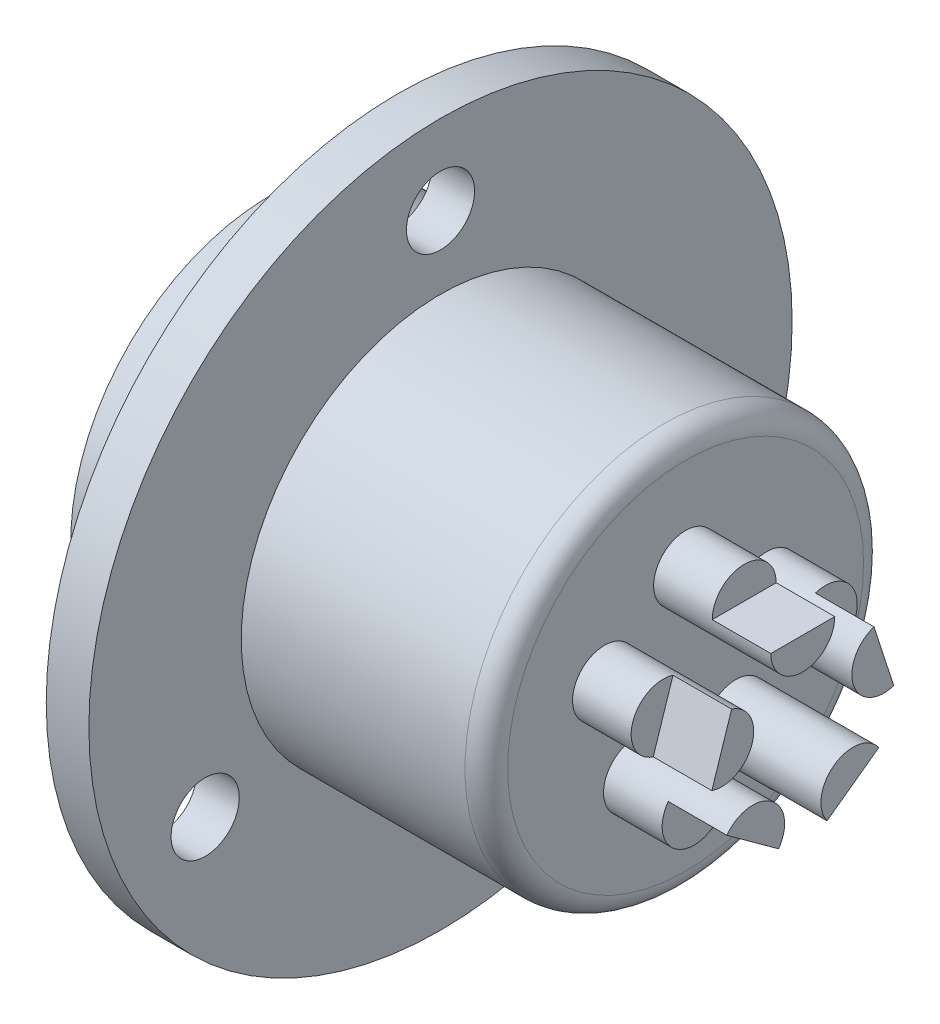
ISO-10303-21;
HEADER;
FILE_DESCRIPTION(('STEP AP214'),'2;1');
FILE_NAME('part.step','',(''),(''),'','','');
FILE_SCHEMA(('AUTOMOTIVE_DESIGN { 1 0 10303 214 1 1 1 1 }'));
ENDSEC;
DATA;
#1=APPLICATION_CONTEXT('core data for automotive mechanical design processes');
#2=APPLICATION_PROTOCOL_DEFINITION('international standard','automotive_design',2000,#1);
#3=PRODUCT_CONTEXT('',#1,'mechanical');
#4=PRODUCT('Part','Part','',(#3));
#5=PRODUCT_RELATED_PRODUCT_CATEGORY('part','',(#4));
#6=PRODUCT_DEFINITION_FORMATION('','',#4);
#7=PRODUCT_DEFINITION_CONTEXT('part definition',#1,'design');
#8=PRODUCT_DEFINITION('design','',#6,#7);
#9=PRODUCT_DEFINITION_SHAPE('','',#8);
#10=(LENGTH_UNIT() NAMED_UNIT(*) SI_UNIT(.MILLI.,.METRE.));
#11=(NAMED_UNIT(*) PLANE_ANGLE_UNIT() SI_UNIT($,.RADIAN.));
#12=(NAMED_UNIT(*) SI_UNIT($,.STERADIAN.) SOLID_ANGLE_UNIT());
#13=UNCERTAINTY_MEASURE_WITH_UNIT(LENGTH_MEASURE(1.E-05),#10,'distance_accuracy_value','');
#14=(GEOMETRIC_REPRESENTATION_CONTEXT(3) GLOBAL_UNCERTAINTY_ASSIGNED_CONTEXT((#13)) GLOBAL_UNIT_ASSIGNED_CONTEXT((#10,
#11,#12)) REPRESENTATION_CONTEXT('',''));
#15=CARTESIAN_POINT('',(0.,0.,0.));
#16=DIRECTION('',(0.,0.,1.));
#17=DIRECTION('',(1.,0.,0.));
#18=AXIS2_PLACEMENT_3D('',#15,#16,#17);
#19=CARTESIAN_POINT('',(25.,-8.11393202250022,3.80422606518062));
#20=DIRECTION('',(-1.,0.,0.));
#21=DIRECTION('',(0.,-0.951056516295155,0.309016994374945));
#22=AXIS2_PLACEMENT_3D('',#19,#20,#21);
#23=PLANE('',#22);
#24=DIRECTION('',(0.,0.951056516295155,-0.309016994374945));
#25=VECTOR('',#24,1.);
#26=CARTESIAN_POINT('',(25.,-9.54051679694295,4.26775155674304));
#27=LINE('',#26,#25);
#28=CARTESIAN_POINT('',(25.,-9.54051679694295,4.26775155674304));
#29=VERTEX_POINT('',#28);
#30=CARTESIAN_POINT('',(25.,-6.68734724805749,3.3407005736182));
#31=VERTEX_POINT('',#30);
#32=EDGE_CURVE('E306',#29,#31,#27,.T.);
#33=ORIENTED_EDGE('',*,*,#32,.F.);
#34=CARTESIAN_POINT('',(25.,-8.11393202250022,3.80422606518062));
#35=DIRECTION('',(-1.,0.,0.));
#36=DIRECTION('',(0.,-0.951056516295155,0.309016994374945));
#37=AXIS2_PLACEMENT_3D('',#34,#35,#36);
#38=CIRCLE('',#37,1.5);
#39=EDGE_CURVE('E129',#31,#29,#38,.T.);
#40=ORIENTED_EDGE('',*,*,#39,.F.);
#41=EDGE_LOOP('',(#33,#40));
#42=FACE_BOUND('',#41,.T.);
#43=ADVANCED_FACE('F34',(#42),#23,.F.);
#44=CARTESIAN_POINT('',(25.,-12.5860679774998,2.35114100916987));
#45=DIRECTION('',(-1.,0.,0.));
#46=DIRECTION('',(0.,0.,1.));
#47=AXIS2_PLACEMENT_3D('',#44,#45,#46);
#48=CYLINDRICAL_SURFACE('',#47,1.5);
#49=DIRECTION('',(1.,0.,0.));
#50=VECTOR('',#49,1.);
#51=CARTESIAN_POINT('',(25.,-13.4677458559385,1.13761551760745));
#52=LINE('',#51,#50);
#53=CARTESIAN_POINT('',(22.25,-13.4677458559385,1.13761551760745));
#54=VERTEX_POINT('',#53);
#55=CARTESIAN_POINT('',(25.,-13.4677458559385,1.13761551760745));
#56=VERTEX_POINT('',#55);
#57=EDGE_CURVE('E57',#54,#56,#52,.T.);
#58=ORIENTED_EDGE('',*,*,#57,.F.);
#59=CARTESIAN_POINT('',(22.25,-12.5860679774998,2.35114100916987));
#60=DIRECTION('',(-1.,0.,0.));
#61=DIRECTION('',(0.,0.,1.));
#62=AXIS2_PLACEMENT_3D('',#59,#60,#61);
#63=CIRCLE('',#62,1.5);
#64=CARTESIAN_POINT('',(22.25,-11.7043900990611,3.5646665007323));
#65=VERTEX_POINT('',#64);
#66=EDGE_CURVE('E125',#65,#54,#63,.F.);
#67=ORIENTED_EDGE('',*,*,#66,.F.);
#68=DIRECTION('',(-1.,0.,0.));
#69=VECTOR('',#68,1.);
#70=CARTESIAN_POINT('',(25.,-11.7043900990611,3.5646665007323));
#71=LINE('',#70,#69);
#72=CARTESIAN_POINT('',(25.,-11.7043900990611,3.5646665007323));
#73=VERTEX_POINT('',#72);
#74=EDGE_CURVE('E114',#73,#65,#71,.T.);
#75=ORIENTED_EDGE('',*,*,#74,.F.);
#76=CARTESIAN_POINT('',(25.,-12.5860679774998,2.35114100916987));
#77=DIRECTION('',(-1.,0.,0.));
#78=DIRECTION('',(0.,-0.587785252292469,-0.809016994374951));
#79=AXIS2_PLACEMENT_3D('',#76,#77,#78);
#80=CIRCLE('',#79,1.5);
#81=EDGE_CURVE('E124',#73,#56,#80,.T.);
#82=ORIENTED_EDGE('',*,*,#81,.T.);
#83=EDGE_LOOP('',(#58,#67,#75,#82));
#84=FACE_BOUND('',#83,.T.);
#85=CARTESIAN_POINT('',(19.5,-12.5860679774998,2.35114100916987));
#86=DIRECTION('',(1.,0.,0.));
#87=DIRECTION('',(0.,0.,-1.));
#88=AXIS2_PLACEMENT_3D('',#85,#86,#87);
#89=CIRCLE('',#88,1.5);
#90=CARTESIAN_POINT('',(19.5,-12.5860679774998,0.851141009169874));
#91=VERTEX_POINT('',#90);
#92=EDGE_CURVE('E175',#91,#91,#89,.T.);
#93=ORIENTED_EDGE('',*,*,#92,.T.);
#94=EDGE_LOOP('',(#93));
#95=FACE_BOUND('',#94,.T.);
#96=ADVANCED_FACE('F122',(#84,#95),#48,.T.);
#97=CARTESIAN_POINT('',(25.,-12.5860679774998,2.35114100916987));
#98=DIRECTION('',(-1.,0.,0.));
#99=DIRECTION('',(0.,-0.587785252292469,-0.809016994374951));
#100=AXIS2_PLACEMENT_3D('',#97,#98,#99);
#101=PLANE('',#100);
#102=DIRECTION('',(0.,0.587785252292468,0.809016994374951));
#103=VECTOR('',#102,1.);
#104=CARTESIAN_POINT('',(25.,-13.4677458559385,1.13761551760745));
#105=LINE('',#104,#103);
#106=EDGE_CURVE('E111',#56,#73,#105,.T.);
#107=ORIENTED_EDGE('',*,*,#106,.F.);
#108=ORIENTED_EDGE('',*,*,#81,.F.);
#109=EDGE_LOOP('',(#107,#108));
#110=FACE_BOUND('',#109,.T.);
#111=ADVANCED_FACE('F128',(#110),#101,.F.);
#112=CARTESIAN_POINT('',(25.,-12.5860679774998,-2.35114100916992));
#113=DIRECTION('',(-1.,0.,0.));
#114=DIRECTION('',(0.,0.58778525229248,-0.809016994374942));
#115=AXIS2_PLACEMENT_3D('',#112,#113,#114);
#116=PLANE('',#115);
#117=DIRECTION('',(0.,-0.58778525229248,0.809016994374942));
#118=VECTOR('',#117,1.);
#119=CARTESIAN_POINT('',(25.,-11.704390099061,-3.56466650073234));
#120=LINE('',#119,#118);
#121=CARTESIAN_POINT('',(25.,-11.704390099061,-3.56466650073233));
#122=VERTEX_POINT('',#121);
#123=CARTESIAN_POINT('',(25.,-13.4677458559385,-1.13761551760751));
#124=VERTEX_POINT('',#123);
#125=EDGE_CURVE('E307',#122,#124,#120,.T.);
#126=ORIENTED_EDGE('',*,*,#125,.F.);
#127=CARTESIAN_POINT('',(25.,-12.5860679774998,-2.35114100916992));
#128=DIRECTION('',(-1.,0.,0.));
#129=DIRECTION('',(0.,0.58778525229248,-0.809016994374942));
#130=AXIS2_PLACEMENT_3D('',#127,#128,#129);
#131=CIRCLE('',#130,1.5);
#132=EDGE_CURVE('E130',#124,#122,#131,.T.);
#133=ORIENTED_EDGE('',*,*,#132,.F.);
#134=EDGE_LOOP('',(#126,#133));
#135=FACE_BOUND('',#134,.T.);
#136=ADVANCED_FACE('F365',(#135),#116,.F.);
#137=CARTESIAN_POINT('',(25.,-8.11393202250017,-3.8042260651806));
#138=DIRECTION('',(-1.,0.,0.));
#139=DIRECTION('',(0.,0.95105651629515,0.309016994374958));
#140=AXIS2_PLACEMENT_3D('',#137,#138,#139);
#141=PLANE('',#140);
#142=DIRECTION('',(0.,-0.95105651629515,-0.309016994374958));
#143=VECTOR('',#142,1.);
#144=CARTESIAN_POINT('',(25.,-6.68734724805744,-3.34070057361816));
#145=LINE('',#144,#143);
#146=CARTESIAN_POINT('',(25.,-6.68734724805744,-3.34070057361816));
#147=VERTEX_POINT('',#146);
#148=CARTESIAN_POINT('',(25.,-9.54051679694289,-4.26775155674304));
#149=VERTEX_POINT('',#148);
#150=EDGE_CURVE('E200',#147,#149,#145,.T.);
#151=ORIENTED_EDGE('',*,*,#150,.F.);
#152=CARTESIAN_POINT('',(25.,-8.11393202250017,-3.8042260651806));
#153=DIRECTION('',(-1.,0.,0.));
#154=DIRECTION('',(0.,0.95105651629515,0.309016994374958));
#155=AXIS2_PLACEMENT_3D('',#152,#153,#154);
#156=CIRCLE('',#155,1.5);
#157=EDGE_CURVE('E136',#149,#147,#156,.T.);
#158=ORIENTED_EDGE('',*,*,#157,.F.);
#159=EDGE_LOOP('',(#151,#158));
#160=FACE_BOUND('',#159,.T.);
#161=ADVANCED_FACE('F244',(#160),#141,.F.);
#162=CARTESIAN_POINT('',(25.,-5.35,0.));
#163=DIRECTION('',(-1.,0.,0.));
#164=DIRECTION('',(0.,0.,1.));
#165=AXIS2_PLACEMENT_3D('',#162,#163,#164);
#166=PLANE('',#165);
#167=DIRECTION('',(0.,0.,-1.));
#168=VECTOR('',#167,1.);
#169=CARTESIAN_POINT('',(25.,-5.35,1.5));
#170=LINE('',#169,#168);
#171=CARTESIAN_POINT('',(25.,-5.35,1.5));
#172=VERTEX_POINT('',#171);
#173=CARTESIAN_POINT('',(25.,-5.35,-1.5));
#174=VERTEX_POINT('',#173);
#175=EDGE_CURVE('E133',#172,#174,#170,.T.);
#176=ORIENTED_EDGE('',*,*,#175,.F.);
#177=CARTESIAN_POINT('',(25.,-5.35,0.));
#178=DIRECTION('',(-1.,0.,0.));
#179=DIRECTION('',(0.,0.,1.));
#180=AXIS2_PLACEMENT_3D('',#177,#178,#179);
#181=CIRCLE('',#180,1.5);
#182=EDGE_CURVE('E149',#174,#172,#181,.T.);
#183=ORIENTED_EDGE('',*,*,#182,.F.);
#184=EDGE_LOOP('',(#176,#183));
#185=FACE_BOUND('',#184,.T.);
#186=ADVANCED_FACE('F240',(#185),#166,.F.);
#187=CARTESIAN_POINT('',(0.,-9.35,0.));
#188=DIRECTION('',(-1.,0.,0.));
#189=DIRECTION('',(0.,0.,1.));
#190=AXIS2_PLACEMENT_3D('',#187,#188,#189);
#191=PLANE('',#190);
#192=CARTESIAN_POINT('',(0.,-9.35,0.));
#193=DIRECTION('',(-1.,0.,0.));
#194=DIRECTION('',(0.,0.,1.));
#195=AXIS2_PLACEMENT_3D('',#192,#193,#194);
#196=CIRCLE('',#195,8.);
#197=CARTESIAN_POINT('',(0.,-9.35,8.));
#198=VERTEX_POINT('',#197);
#199=EDGE_CURVE('E277',#198,#198,#196,.T.);
#200=ORIENTED_EDGE('',*,*,#199,.F.);
#201=EDGE_LOOP('',(#200));
#202=FACE_BOUND('',#201,.T.);
#203=CARTESIAN_POINT('',(0.,-9.35,0.));
#204=DIRECTION('',(1.,0.,0.));
#205=DIRECTION('',(0.,0.,-1.));
#206=AXIS2_PLACEMENT_3D('',#203,#204,#205);
#207=CIRCLE('',#206,9.35);
#208=CARTESIAN_POINT('',(0.,-9.35,-9.35));
#209=VERTEX_POINT('',#208);
#210=EDGE_CURVE('E164',#209,#209,#207,.T.);
#211=ORIENTED_EDGE('',*,*,#210,.F.);
#212=EDGE_LOOP('',(#211));
#213=FACE_BOUND('',#212,.T.);
#214=ADVANCED_FACE('F243',(#202,#213),#191,.T.);
#215=CARTESIAN_POINT('',(19.5,-9.35,0.));
#216=DIRECTION('',(1.,0.,0.));
#217=DIRECTION('',(0.,0.,-1.));
#218=AXIS2_PLACEMENT_3D('',#215,#216,#217);
#219=CYLINDRICAL_SURFACE('',#218,9.35);
#220=ORIENTED_EDGE('',*,*,#210,.T.);
#221=EDGE_LOOP('',(#220));
#222=FACE_BOUND('',#221,.T.);
#223=CARTESIAN_POINT('',(6.,-9.35,0.));
#224=DIRECTION('',(1.,0.,0.));
#225=DIRECTION('',(0.,0.,-1.));
#226=AXIS2_PLACEMENT_3D('',#223,#224,#225);
#227=CIRCLE('',#226,9.35);
#228=CARTESIAN_POINT('',(6.,-9.35,-9.35));
#229=VERTEX_POINT('',#228);
#230=EDGE_CURVE('E161',#229,#229,#227,.T.);
#231=ORIENTED_EDGE('',*,*,#230,.F.);
#232=EDGE_LOOP('',(#231));
#233=FACE_BOUND('',#232,.T.);
#234=ADVANCED_FACE('F266',(#222,#233),#219,.T.);
#235=CARTESIAN_POINT('',(6.,0.,0.));
#236=DIRECTION('',(-1.,0.,0.));
#237=DIRECTION('',(0.,0.,1.));
#238=AXIS2_PLACEMENT_3D('',#235,#236,#237);
#239=PLANE('',#238);
#240=CARTESIAN_POINT('',(6.,3.4,0.));
#241=DIRECTION('',(1.,0.,0.));
#242=DIRECTION('',(0.,0.,-1.));
#243=AXIS2_PLACEMENT_3D('',#240,#241,#242);
#244=CIRCLE('',#243,1.6);
#245=CARTESIAN_POINT('',(6.,3.4,-1.60000000000002));
#246=VERTEX_POINT('',#245);
#247=EDGE_CURVE('E195',#246,#246,#244,.T.);
#248=ORIENTED_EDGE('',*,*,#247,.T.);
#249=EDGE_LOOP('',(#248));
#250=FACE_BOUND('',#249,.T.);
#251=CARTESIAN_POINT('',(6.,-15.725,-11.0418238982516));
#252=DIRECTION('',(1.,0.,0.));
#253=DIRECTION('',(0.,0.,-1.));
#254=AXIS2_PLACEMENT_3D('',#251,#252,#253);
#255=CIRCLE('',#254,1.59999999999999);
#256=CARTESIAN_POINT('',(6.,-15.725,-12.6418238982516));
#257=VERTEX_POINT('',#256);
#258=EDGE_CURVE('E299',#257,#257,#255,.T.);
#259=ORIENTED_EDGE('',*,*,#258,.T.);
#260=EDGE_LOOP('',(#259));
#261=FACE_BOUND('',#260,.T.);
#262=CARTESIAN_POINT('',(6.,-15.725,11.0418238982516));
#263=DIRECTION('',(1.,0.,0.));
#264=DIRECTION('',(0.,0.,-1.));
#265=AXIS2_PLACEMENT_3D('',#262,#263,#264);
#266=CIRCLE('',#265,1.60000000000001);
#267=CARTESIAN_POINT('',(6.,-15.725,9.4418238982516));
#268=VERTEX_POINT('',#267);
#269=EDGE_CURVE('E294',#268,#268,#266,.T.);
#270=ORIENTED_EDGE('',*,*,#269,.T.);
#271=EDGE_LOOP('',(#270));
#272=FACE_BOUND('',#271,.T.);
#273=ORIENTED_EDGE('',*,*,#230,.T.);
#274=EDGE_LOOP('',(#273));
#275=FACE_BOUND('',#274,.T.);
#276=CARTESIAN_POINT('',(6.,-9.35,0.));
#277=DIRECTION('',(1.,0.,0.));
#278=DIRECTION('',(0.,0.,-1.));
#279=AXIS2_PLACEMENT_3D('',#276,#277,#278);
#280=CIRCLE('',#279,16.5);
#281=CARTESIAN_POINT('',(6.,-9.35,-16.5));
#282=VERTEX_POINT('',#281);
#283=EDGE_CURVE('E158',#282,#282,#280,.T.);
#284=ORIENTED_EDGE('',*,*,#283,.F.);
#285=EDGE_LOOP('',(#284));
#286=FACE_BOUND('',#285,.T.);
#287=ADVANCED_FACE('F262',(#250,#261,#272,#275,#286),#239,.T.);
#288=CARTESIAN_POINT('',(19.5,-9.35,0.));
#289=DIRECTION('',(1.,0.,0.));
#290=DIRECTION('',(0.,0.,-1.));
#291=AXIS2_PLACEMENT_3D('',#288,#289,#290);
#292=CYLINDRICAL_SURFACE('',#291,16.5);
#293=ORIENTED_EDGE('',*,*,#283,.T.);
#294=EDGE_LOOP('',(#293));
#295=FACE_BOUND('',#294,.T.);
#296=CARTESIAN_POINT('',(8.,-9.35,0.));
#297=DIRECTION('',(1.,0.,0.));
#298=DIRECTION('',(0.,0.,-1.));
#299=AXIS2_PLACEMENT_3D('',#296,#297,#298);
#300=CIRCLE('',#299,16.5);
#301=CARTESIAN_POINT('',(8.,-9.35,-16.5));
#302=VERTEX_POINT('',#301);
#303=EDGE_CURVE('E155',#302,#302,#300,.T.);
#304=ORIENTED_EDGE('',*,*,#303,.F.);
#305=EDGE_LOOP('',(#304));
#306=FACE_BOUND('',#305,.T.);
#307=ADVANCED_FACE('F258',(#295,#306),#292,.T.);
#308=CARTESIAN_POINT('',(8.,7.15,0.));
#309=DIRECTION('',(1.,0.,0.));
#310=DIRECTION('',(0.,0.,-1.));
#311=AXIS2_PLACEMENT_3D('',#308,#309,#310);
#312=PLANE('',#311);
#313=CARTESIAN_POINT('',(8.,3.4,0.));
#314=DIRECTION('',(1.,0.,0.));
#315=DIRECTION('',(0.,0.,-1.));
#316=AXIS2_PLACEMENT_3D('',#313,#314,#315);
#317=CIRCLE('',#316,1.6);
#318=CARTESIAN_POINT('',(8.,3.4,-1.60000000000002));
#319=VERTEX_POINT('',#318);
#320=EDGE_CURVE('E198',#319,#319,#317,.F.);
#321=ORIENTED_EDGE('',*,*,#320,.T.);
#322=EDGE_LOOP('',(#321));
#323=FACE_BOUND('',#322,.T.);
#324=CARTESIAN_POINT('',(8.,-15.725,-11.0418238982516));
#325=DIRECTION('',(1.,0.,0.));
#326=DIRECTION('',(0.,0.,-1.));
#327=AXIS2_PLACEMENT_3D('',#324,#325,#326);
#328=CIRCLE('',#327,1.59999999999999);
#329=CARTESIAN_POINT('',(8.,-15.725,-12.6418238982516));
#330=VERTEX_POINT('',#329);
#331=EDGE_CURVE('E194',#330,#330,#328,.F.);
#332=ORIENTED_EDGE('',*,*,#331,.T.);
#333=EDGE_LOOP('',(#332));
#334=FACE_BOUND('',#333,.T.);
#335=CARTESIAN_POINT('',(8.,-15.725,11.0418238982516));
#336=DIRECTION('',(1.,0.,0.));
#337=DIRECTION('',(0.,0.,-1.));
#338=AXIS2_PLACEMENT_3D('',#335,#336,#337);
#339=CIRCLE('',#338,1.60000000000001);
#340=CARTESIAN_POINT('',(8.,-15.725,9.4418238982516));
#341=VERTEX_POINT('',#340);
#342=EDGE_CURVE('E191',#341,#341,#339,.F.);
#343=ORIENTED_EDGE('',*,*,#342,.T.);
#344=EDGE_LOOP('',(#343));
#345=FACE_BOUND('',#344,.T.);
#346=ORIENTED_EDGE('',*,*,#303,.T.);
#347=EDGE_LOOP('',(#346));
#348=FACE_BOUND('',#347,.T.);
#349=CARTESIAN_POINT('',(8.,-9.35,0.));
#350=DIRECTION('',(1.,0.,0.));
#351=DIRECTION('',(0.,0.,-1.));
#352=AXIS2_PLACEMENT_3D('',#349,#350,#351);
#353=CIRCLE('',#352,9.35);
#354=CARTESIAN_POINT('',(8.,-9.35,-9.35));
#355=VERTEX_POINT('',#354);
#356=EDGE_CURVE('E152',#355,#355,#353,.T.);
#357=ORIENTED_EDGE('',*,*,#356,.F.);
#358=EDGE_LOOP('',(#357));
#359=FACE_BOUND('',#358,.T.);
#360=ADVANCED_FACE('F254',(#323,#334,#345,#348,#359),#312,.T.);
#361=CARTESIAN_POINT('',(19.5,-9.35,0.));
#362=DIRECTION('',(1.,0.,0.));
#363=DIRECTION('',(0.,0.,-1.));
#364=AXIS2_PLACEMENT_3D('',#361,#362,#363);
#365=CYLINDRICAL_SURFACE('',#364,9.35);
#366=CARTESIAN_POINT('',(18.5,-9.35,0.));
#367=DIRECTION('',(1.,0.,0.));
#368=DIRECTION('',(0.,0.,-1.));
#369=AXIS2_PLACEMENT_3D('',#366,#367,#368);
#370=CIRCLE('',#369,9.35);
#371=CARTESIAN_POINT('',(18.5,-9.35,-9.35));
#372=VERTEX_POINT('',#371);
#373=EDGE_CURVE('E11',#372,#372,#370,.F.);
#374=ORIENTED_EDGE('',*,*,#373,.T.);
#375=EDGE_LOOP('',(#374));
#376=FACE_BOUND('',#375,.T.);
#377=ORIENTED_EDGE('',*,*,#356,.T.);
#378=EDGE_LOOP('',(#377));
#379=FACE_BOUND('',#378,.T.);
#380=ADVANCED_FACE('F251',(#376,#379),#365,.T.);
#381=CARTESIAN_POINT('',(19.5,0.,0.));
#382=DIRECTION('',(1.,0.,0.));
#383=DIRECTION('',(0.,0.,-1.));
#384=AXIS2_PLACEMENT_3D('',#381,#382,#383);
#385=PLANE('',#384);
#386=CARTESIAN_POINT('',(19.5,-9.35,0.));
#387=DIRECTION('',(1.,0.,0.));
#388=DIRECTION('',(0.,0.,-1.));
#389=AXIS2_PLACEMENT_3D('',#386,#387,#388);
#390=CIRCLE('',#389,8.35);
#391=CARTESIAN_POINT('',(19.5,-9.35,-8.35));
#392=VERTEX_POINT('',#391);
#393=EDGE_CURVE('E42',#392,#392,#390,.T.);
#394=ORIENTED_EDGE('',*,*,#393,.T.);
#395=EDGE_LOOP('',(#394));
#396=FACE_BOUND('',#395,.T.);
#397=CARTESIAN_POINT('',(19.5,-8.11393202250017,-3.8042260651806));
#398=DIRECTION('',(1.,0.,0.));
#399=DIRECTION('',(0.,0.,-1.));
#400=AXIS2_PLACEMENT_3D('',#397,#398,#399);
#401=CIRCLE('',#400,1.5);
#402=CARTESIAN_POINT('',(19.5,-8.11393202250017,-5.3042260651806));
#403=VERTEX_POINT('',#402);
#404=EDGE_CURVE('E181',#403,#403,#401,.T.);
#405=ORIENTED_EDGE('',*,*,#404,.F.);
#406=EDGE_LOOP('',(#405));
#407=FACE_BOUND('',#406,.T.);
#408=CARTESIAN_POINT('',(19.5,-12.5860679774998,-2.35114100916992));
#409=DIRECTION('',(1.,0.,0.));
#410=DIRECTION('',(0.,0.,-1.));
#411=AXIS2_PLACEMENT_3D('',#408,#409,#410);
#412=CIRCLE('',#411,1.5);
#413=CARTESIAN_POINT('',(19.5,-12.5860679774998,-3.85114100916992));
#414=VERTEX_POINT('',#413);
#415=EDGE_CURVE('E178',#414,#414,#412,.T.);
#416=ORIENTED_EDGE('',*,*,#415,.F.);
#417=EDGE_LOOP('',(#416));
#418=FACE_BOUND('',#417,.T.);
#419=ORIENTED_EDGE('',*,*,#92,.F.);
#420=EDGE_LOOP('',(#419));
#421=FACE_BOUND('',#420,.T.);
#422=CARTESIAN_POINT('',(19.5,-8.11393202250022,3.80422606518062));
#423=DIRECTION('',(1.,0.,0.));
#424=DIRECTION('',(0.,0.,-1.));
#425=AXIS2_PLACEMENT_3D('',#422,#423,#424);
#426=CIRCLE('',#425,1.5);
#427=CARTESIAN_POINT('',(19.5,-8.11393202250022,2.30422606518062));
#428=VERTEX_POINT('',#427);
#429=EDGE_CURVE('E172',#428,#428,#426,.T.);
#430=ORIENTED_EDGE('',*,*,#429,.F.);
#431=EDGE_LOOP('',(#430));
#432=FACE_BOUND('',#431,.T.);
#433=CARTESIAN_POINT('',(19.5,-5.35,0.));
#434=DIRECTION('',(1.,0.,0.));
#435=DIRECTION('',(0.,0.,-1.));
#436=AXIS2_PLACEMENT_3D('',#433,#434,#435);
#437=CIRCLE('',#436,1.5);
#438=CARTESIAN_POINT('',(19.5,-5.35,-1.5));
#439=VERTEX_POINT('',#438);
#440=EDGE_CURVE('E167',#439,#439,#437,.T.);
#441=ORIENTED_EDGE('',*,*,#440,.F.);
#442=EDGE_LOOP('',(#441));
#443=FACE_BOUND('',#442,.T.);
#444=ADVANCED_FACE('F204',(#396,#407,#418,#421,#432,#443),#385,.T.);
#445=CARTESIAN_POINT('',(25.,-5.35,0.));
#446=DIRECTION('',(-1.,0.,0.));
#447=DIRECTION('',(0.,0.,1.));
#448=AXIS2_PLACEMENT_3D('',#445,#446,#447);
#449=CYLINDRICAL_SURFACE('',#448,1.5);
#450=CARTESIAN_POINT('',(22.25,-5.35,0.));
#451=DIRECTION('',(-1.,0.,0.));
#452=DIRECTION('',(0.,0.,1.));
#453=AXIS2_PLACEMENT_3D('',#450,#451,#452);
#454=CIRCLE('',#453,1.5);
#455=CARTESIAN_POINT('',(22.25,-5.35,-1.5));
#456=VERTEX_POINT('',#455);
#457=CARTESIAN_POINT('',(22.25,-5.35,1.5));
#458=VERTEX_POINT('',#457);
#459=EDGE_CURVE('E170',#456,#458,#454,.F.);
#460=ORIENTED_EDGE('',*,*,#459,.F.);
#461=DIRECTION('',(-1.,0.,0.));
#462=VECTOR('',#461,1.);
#463=CARTESIAN_POINT('',(25.,-5.35,-1.5));
#464=LINE('',#463,#462);
#465=EDGE_CURVE('E141',#174,#456,#464,.T.);
#466=ORIENTED_EDGE('',*,*,#465,.F.);
#467=ORIENTED_EDGE('',*,*,#182,.T.);
#468=DIRECTION('',(1.,0.,0.));
#469=VECTOR('',#468,1.);
#470=CARTESIAN_POINT('',(25.,-5.35,1.5));
#471=LINE('',#470,#469);
#472=EDGE_CURVE('E147',#458,#172,#471,.T.);
#473=ORIENTED_EDGE('',*,*,#472,.F.);
#474=EDGE_LOOP('',(#460,#466,#467,#473));
#475=FACE_BOUND('',#474,.T.);
#476=ORIENTED_EDGE('',*,*,#440,.T.);
#477=EDGE_LOOP('',(#476));
#478=FACE_BOUND('',#477,.T.);
#479=ADVANCED_FACE('F238',(#475,#478),#449,.T.);
#480=CARTESIAN_POINT('',(22.25,-5.35,1.5));
#481=DIRECTION('',(-1.,0.,0.));
#482=DIRECTION('',(0.,0.,1.));
#483=AXIS2_PLACEMENT_3D('',#480,#481,#482);
#484=PLANE('',#483);
#485=DIRECTION('',(0.,0.,1.));
#486=VECTOR('',#485,1.);
#487=CARTESIAN_POINT('',(22.25,-5.35,1.5));
#488=LINE('',#487,#486);
#489=EDGE_CURVE('E144',#456,#458,#488,.T.);
#490=ORIENTED_EDGE('',*,*,#489,.F.);
#491=ORIENTED_EDGE('',*,*,#459,.T.);
#492=EDGE_LOOP('',(#490,#491));
#493=FACE_BOUND('',#492,.T.);
#494=ADVANCED_FACE('F234',(#493),#484,.F.);
#495=CARTESIAN_POINT('',(0.,-5.35,0.));
#496=DIRECTION('',(0.,1.,0.));
#497=DIRECTION('',(0.,0.,1.));
#498=AXIS2_PLACEMENT_3D('',#495,#496,#497);
#499=PLANE('',#498);
#500=ORIENTED_EDGE('',*,*,#175,.T.);
#501=ORIENTED_EDGE('',*,*,#465,.T.);
#502=ORIENTED_EDGE('',*,*,#489,.T.);
#503=ORIENTED_EDGE('',*,*,#472,.T.);
#504=EDGE_LOOP('',(#500,#501,#502,#503));
#505=FACE_BOUND('',#504,.T.);
#506=ADVANCED_FACE('F230',(#505),#499,.T.);
#507=CARTESIAN_POINT('',(25.,-8.11393202250022,3.80422606518062));
#508=DIRECTION('',(-1.,0.,0.));
#509=DIRECTION('',(0.,0.,1.));
#510=AXIS2_PLACEMENT_3D('',#507,#508,#509);
#511=CYLINDRICAL_SURFACE('',#510,1.5);
#512=CARTESIAN_POINT('',(22.25,-8.11393202250022,3.80422606518062));
#513=DIRECTION('',(-1.,0.,0.));
#514=DIRECTION('',(0.,0.,1.));
#515=AXIS2_PLACEMENT_3D('',#512,#513,#514);
#516=CIRCLE('',#515,1.5);
#517=CARTESIAN_POINT('',(22.25,-6.68734724805749,3.3407005736182));
#518=VERTEX_POINT('',#517);
#519=CARTESIAN_POINT('',(22.25,-9.54051679694295,4.26775155674304));
#520=VERTEX_POINT('',#519);
#521=EDGE_CURVE('E189',#518,#520,#516,.F.);
#522=ORIENTED_EDGE('',*,*,#521,.F.);
#523=DIRECTION('',(-1.,0.,0.));
#524=VECTOR('',#523,1.);
#525=CARTESIAN_POINT('',(25.,-6.68734724805749,3.3407005736182));
#526=LINE('',#525,#524);
#527=EDGE_CURVE('E326',#31,#518,#526,.T.);
#528=ORIENTED_EDGE('',*,*,#527,.F.);
#529=ORIENTED_EDGE('',*,*,#39,.T.);
#530=DIRECTION('',(1.,0.,0.));
#531=VECTOR('',#530,1.);
#532=CARTESIAN_POINT('',(25.,-9.54051679694295,4.26775155674304));
#533=LINE('',#532,#531);
#534=EDGE_CURVE('E49',#520,#29,#533,.T.);
#535=ORIENTED_EDGE('',*,*,#534,.F.);
#536=EDGE_LOOP('',(#522,#528,#529,#535));
#537=FACE_BOUND('',#536,.T.);
#538=ORIENTED_EDGE('',*,*,#429,.T.);
#539=EDGE_LOOP('',(#538));
#540=FACE_BOUND('',#539,.T.);
#541=ADVANCED_FACE('F226',(#537,#540),#511,.T.);
#542=CARTESIAN_POINT('',(25.,-12.5860679774998,-2.35114100916992));
#543=DIRECTION('',(-1.,0.,0.));
#544=DIRECTION('',(0.,0.,1.));
#545=AXIS2_PLACEMENT_3D('',#542,#543,#544);
#546=CYLINDRICAL_SURFACE('',#545,1.5);
#547=CARTESIAN_POINT('',(22.25,-12.5860679774998,-2.35114100916992));
#548=DIRECTION('',(-1.,0.,0.));
#549=DIRECTION('',(0.,0.,1.));
#550=AXIS2_PLACEMENT_3D('',#547,#548,#549);
#551=CIRCLE('',#550,1.5);
#552=CARTESIAN_POINT('',(22.25,-13.4677458559385,-1.13761551760751));
#553=VERTEX_POINT('',#552);
#554=CARTESIAN_POINT('',(22.25,-11.704390099061,-3.56466650073234));
#555=VERTEX_POINT('',#554);
#556=EDGE_CURVE('E186',#553,#555,#551,.F.);
#557=ORIENTED_EDGE('',*,*,#556,.F.);
#558=DIRECTION('',(-1.,0.,0.));
#559=VECTOR('',#558,1.);
#560=CARTESIAN_POINT('',(25.,-13.4677458559385,-1.13761551760751));
#561=LINE('',#560,#559);
#562=EDGE_CURVE('E309',#124,#553,#561,.T.);
#563=ORIENTED_EDGE('',*,*,#562,.F.);
#564=ORIENTED_EDGE('',*,*,#132,.T.);
#565=DIRECTION('',(1.,0.,0.));
#566=VECTOR('',#565,1.);
#567=CARTESIAN_POINT('',(25.,-11.704390099061,-3.56466650073234));
#568=LINE('',#567,#566);
#569=EDGE_CURVE('E119',#555,#122,#568,.T.);
#570=ORIENTED_EDGE('',*,*,#569,.F.);
#571=EDGE_LOOP('',(#557,#563,#564,#570));
#572=FACE_BOUND('',#571,.T.);
#573=ORIENTED_EDGE('',*,*,#415,.T.);
#574=EDGE_LOOP('',(#573));
#575=FACE_BOUND('',#574,.T.);
#576=ADVANCED_FACE('F229',(#572,#575),#546,.T.);
#577=CARTESIAN_POINT('',(25.,-8.11393202250017,-3.8042260651806));
#578=DIRECTION('',(-1.,0.,0.));
#579=DIRECTION('',(0.,0.,1.));
#580=AXIS2_PLACEMENT_3D('',#577,#578,#579);
#581=CYLINDRICAL_SURFACE('',#580,1.5);
#582=CARTESIAN_POINT('',(22.25,-8.11393202250017,-3.8042260651806));
#583=DIRECTION('',(-1.,0.,0.));
#584=DIRECTION('',(0.,0.,1.));
#585=AXIS2_PLACEMENT_3D('',#582,#583,#584);
#586=CIRCLE('',#585,1.5);
#587=CARTESIAN_POINT('',(22.25,-9.54051679694289,-4.26775155674304));
#588=VERTEX_POINT('',#587);
#589=CARTESIAN_POINT('',(22.25,-6.68734724805744,-3.34070057361816));
#590=VERTEX_POINT('',#589);
#591=EDGE_CURVE('E184',#588,#590,#586,.F.);
#592=ORIENTED_EDGE('',*,*,#591,.F.);
#593=DIRECTION('',(-1.,0.,0.));
#594=VECTOR('',#593,1.);
#595=CARTESIAN_POINT('',(25.,-9.54051679694289,-4.26775155674304));
#596=LINE('',#595,#594);
#597=EDGE_CURVE('E318',#149,#588,#596,.T.);
#598=ORIENTED_EDGE('',*,*,#597,.F.);
#599=ORIENTED_EDGE('',*,*,#157,.T.);
#600=DIRECTION('',(1.,0.,0.));
#601=VECTOR('',#600,1.);
#602=CARTESIAN_POINT('',(25.,-6.68734724805744,-3.34070057361816));
#603=LINE('',#602,#601);
#604=EDGE_CURVE('E310',#590,#147,#603,.T.);
#605=ORIENTED_EDGE('',*,*,#604,.F.);
#606=EDGE_LOOP('',(#592,#598,#599,#605));
#607=FACE_BOUND('',#606,.T.);
#608=ORIENTED_EDGE('',*,*,#404,.T.);
#609=EDGE_LOOP('',(#608));
#610=FACE_BOUND('',#609,.T.);
#611=ADVANCED_FACE('F336',(#607,#610),#581,.T.);
#612=CARTESIAN_POINT('',(22.25,-6.68734724805744,-3.34070057361816));
#613=DIRECTION('',(-1.,0.,0.));
#614=DIRECTION('',(0.,0.,1.));
#615=AXIS2_PLACEMENT_3D('',#612,#613,#614);
#616=PLANE('',#615);
#617=DIRECTION('',(0.,0.95105651629515,0.309016994374958));
#618=VECTOR('',#617,1.);
#619=CARTESIAN_POINT('',(22.25,-6.68734724805744,-3.34070057361816));
#620=LINE('',#619,#618);
#621=EDGE_CURVE('E321',#588,#590,#620,.T.);
#622=ORIENTED_EDGE('',*,*,#621,.F.);
#623=ORIENTED_EDGE('',*,*,#591,.T.);
#624=EDGE_LOOP('',(#622,#623));
#625=FACE_BOUND('',#624,.T.);
#626=ADVANCED_FACE('F344',(#625),#616,.F.);
#627=CARTESIAN_POINT('',(0.,-8.11393202250017,-3.8042260651806));
#628=DIRECTION('',(0.,0.309016994374958,-0.95105651629515));
#629=DIRECTION('',(0.,0.95105651629515,0.309016994374958));
#630=AXIS2_PLACEMENT_3D('',#627,#628,#629);
#631=PLANE('',#630);
#632=ORIENTED_EDGE('',*,*,#150,.T.);
#633=ORIENTED_EDGE('',*,*,#597,.T.);
#634=ORIENTED_EDGE('',*,*,#621,.T.);
#635=ORIENTED_EDGE('',*,*,#604,.T.);
#636=EDGE_LOOP('',(#632,#633,#634,#635));
#637=FACE_BOUND('',#636,.T.);
#638=ADVANCED_FACE('F341',(#637),#631,.T.);
#639=CARTESIAN_POINT('',(22.25,-11.704390099061,-3.56466650073234));
#640=DIRECTION('',(-1.,0.,0.));
#641=DIRECTION('',(0.,0.,1.));
#642=AXIS2_PLACEMENT_3D('',#639,#640,#641);
#643=PLANE('',#642);
#644=DIRECTION('',(0.,0.58778525229248,-0.809016994374942));
#645=VECTOR('',#644,1.);
#646=CARTESIAN_POINT('',(22.25,-11.704390099061,-3.56466650073234));
#647=LINE('',#646,#645);
#648=EDGE_CURVE('E313',#553,#555,#647,.T.);
#649=ORIENTED_EDGE('',*,*,#648,.F.);
#650=ORIENTED_EDGE('',*,*,#556,.T.);
#651=EDGE_LOOP('',(#649,#650));
#652=FACE_BOUND('',#651,.T.);
#653=ADVANCED_FACE('F351',(#652),#643,.F.);
#654=CARTESIAN_POINT('',(0.,-12.5860679774998,-2.35114100916992));
#655=DIRECTION('',(0.,-0.809016994374942,-0.58778525229248));
#656=DIRECTION('',(0.,0.58778525229248,-0.809016994374942));
#657=AXIS2_PLACEMENT_3D('',#654,#655,#656);
#658=PLANE('',#657);
#659=ORIENTED_EDGE('',*,*,#125,.T.);
#660=ORIENTED_EDGE('',*,*,#562,.T.);
#661=ORIENTED_EDGE('',*,*,#648,.T.);
#662=ORIENTED_EDGE('',*,*,#569,.T.);
#663=EDGE_LOOP('',(#659,#660,#661,#662));
#664=FACE_BOUND('',#663,.T.);
#665=ADVANCED_FACE('F463',(#664),#658,.T.);
#666=CARTESIAN_POINT('',(22.25,-13.4677458559385,1.13761551760745));
#667=DIRECTION('',(-1.,0.,0.));
#668=DIRECTION('',(0.,0.,1.));
#669=AXIS2_PLACEMENT_3D('',#666,#667,#668);
#670=PLANE('',#669);
#671=ORIENTED_EDGE('',*,*,#66,.T.);
#672=DIRECTION('',(0.,-0.587785252292469,-0.809016994374951));
#673=VECTOR('',#672,1.);
#674=CARTESIAN_POINT('',(22.25,-13.4677458559385,1.13761551760745));
#675=LINE('',#674,#673);
#676=EDGE_CURVE('E126',#65,#54,#675,.T.);
#677=ORIENTED_EDGE('',*,*,#676,.F.);
#678=EDGE_LOOP('',(#671,#677));
#679=FACE_BOUND('',#678,.T.);
#680=ADVANCED_FACE('F472',(#679),#670,.F.);
#681=CARTESIAN_POINT('',(0.,-12.5860679774998,2.35114100916987));
#682=DIRECTION('',(0.,-0.809016994374951,0.587785252292469));
#683=DIRECTION('',(0.,-0.587785252292469,-0.809016994374951));
#684=AXIS2_PLACEMENT_3D('',#681,#682,#683);
#685=PLANE('',#684);
#686=ORIENTED_EDGE('',*,*,#106,.T.);
#687=ORIENTED_EDGE('',*,*,#74,.T.);
#688=ORIENTED_EDGE('',*,*,#676,.T.);
#689=ORIENTED_EDGE('',*,*,#57,.T.);
#690=EDGE_LOOP('',(#686,#687,#688,#689));
#691=FACE_BOUND('',#690,.T.);
#692=ADVANCED_FACE('F113',(#691),#685,.T.);
#693=CARTESIAN_POINT('',(22.25,-9.54051679694295,4.26775155674304));
#694=DIRECTION('',(-1.,0.,0.));
#695=DIRECTION('',(0.,0.,1.));
#696=AXIS2_PLACEMENT_3D('',#693,#694,#695);
#697=PLANE('',#696);
#698=DIRECTION('',(0.,-0.951056516295155,0.309016994374945));
#699=VECTOR('',#698,1.);
#700=CARTESIAN_POINT('',(22.25,-9.54051679694295,4.26775155674304));
#701=LINE('',#700,#699);
#702=EDGE_CURVE('E329',#518,#520,#701,.T.);
#703=ORIENTED_EDGE('',*,*,#702,.F.);
#704=ORIENTED_EDGE('',*,*,#521,.T.);
#705=EDGE_LOOP('',(#703,#704));
#706=FACE_BOUND('',#705,.T.);
#707=ADVANCED_FACE('F360',(#706),#697,.F.);
#708=CARTESIAN_POINT('',(0.,-8.11393202250022,3.80422606518062));
#709=DIRECTION('',(0.,0.309016994374945,0.951056516295155));
#710=DIRECTION('',(0.,-0.951056516295155,0.309016994374945));
#711=AXIS2_PLACEMENT_3D('',#708,#709,#710);
#712=PLANE('',#711);
#713=ORIENTED_EDGE('',*,*,#32,.T.);
#714=ORIENTED_EDGE('',*,*,#527,.T.);
#715=ORIENTED_EDGE('',*,*,#702,.T.);
#716=ORIENTED_EDGE('',*,*,#534,.T.);
#717=EDGE_LOOP('',(#713,#714,#715,#716));
#718=FACE_BOUND('',#717,.T.);
#719=ADVANCED_FACE('F356',(#718),#712,.T.);
#720=CARTESIAN_POINT('',(25.,-15.725,11.0418238982516));
#721=DIRECTION('',(-1.,0.,0.));
#722=DIRECTION('',(0.,0.,1.));
#723=AXIS2_PLACEMENT_3D('',#720,#721,#722);
#724=CYLINDRICAL_SURFACE('',#723,1.60000000000001);
#725=ORIENTED_EDGE('',*,*,#342,.F.);
#726=EDGE_LOOP('',(#725));
#727=FACE_BOUND('',#726,.T.);
#728=ORIENTED_EDGE('',*,*,#269,.F.);
#729=EDGE_LOOP('',(#728));
#730=FACE_BOUND('',#729,.T.);
#731=ADVANCED_FACE('F359',(#727,#730),#724,.F.);
#732=CARTESIAN_POINT('',(25.,-15.725,-11.0418238982516));
#733=DIRECTION('',(-1.,0.,0.));
#734=DIRECTION('',(0.,0.,1.));
#735=AXIS2_PLACEMENT_3D('',#732,#733,#734);
#736=CYLINDRICAL_SURFACE('',#735,1.59999999999999);
#737=ORIENTED_EDGE('',*,*,#331,.F.);
#738=EDGE_LOOP('',(#737));
#739=FACE_BOUND('',#738,.T.);
#740=ORIENTED_EDGE('',*,*,#258,.F.);
#741=EDGE_LOOP('',(#740));
#742=FACE_BOUND('',#741,.T.);
#743=ADVANCED_FACE('F525',(#739,#742),#736,.F.);
#744=CARTESIAN_POINT('',(25.,3.4,0.));
#745=DIRECTION('',(-1.,0.,0.));
#746=DIRECTION('',(0.,0.,1.));
#747=AXIS2_PLACEMENT_3D('',#744,#745,#746);
#748=CYLINDRICAL_SURFACE('',#747,1.6);
#749=ORIENTED_EDGE('',*,*,#320,.F.);
#750=EDGE_LOOP('',(#749));
#751=FACE_BOUND('',#750,.T.);
#752=ORIENTED_EDGE('',*,*,#247,.F.);
#753=EDGE_LOOP('',(#752));
#754=FACE_BOUND('',#753,.T.);
#755=ADVANCED_FACE('F535',(#751,#754),#748,.F.);
#756=CARTESIAN_POINT('',(13.,-9.35,0.));
#757=DIRECTION('',(-1.,0.,0.));
#758=DIRECTION('',(0.,0.,1.));
#759=AXIS2_PLACEMENT_3D('',#756,#757,#758);
#760=CYLINDRICAL_SURFACE('',#759,8.);
#761=CARTESIAN_POINT('',(13.,-9.35,0.));
#762=DIRECTION('',(-1.,0.,0.));
#763=DIRECTION('',(0.,0.,1.));
#764=AXIS2_PLACEMENT_3D('',#761,#762,#763);
#765=CIRCLE('',#764,8.);
#766=CARTESIAN_POINT('',(13.,-9.35,8.));
#767=VERTEX_POINT('',#766);
#768=EDGE_CURVE('E291',#767,#767,#765,.T.);
#769=CARTESIAN_POINT('',(13.,-9.35,8.));
#770=CARTESIAN_POINT('',(12.8645833333333,-9.35,8.));
#771=CARTESIAN_POINT('',(12.7291666666667,-9.35,8.));
#772=CARTESIAN_POINT('',(12.4583333333333,-9.35,8.));
#773=CARTESIAN_POINT('',(12.3229166666667,-9.35,8.));
#774=CARTESIAN_POINT('',(12.0520833333333,-9.35,8.));
#775=CARTESIAN_POINT('',(11.9166666666667,-9.35,8.));
#776=CARTESIAN_POINT('',(11.6458333333333,-9.35,8.));
#777=CARTESIAN_POINT('',(11.5104166666667,-9.35,8.));
#778=CARTESIAN_POINT('',(11.2395833333333,-9.35,8.));
#779=CARTESIAN_POINT('',(11.1041666666667,-9.35,8.));
#780=CARTESIAN_POINT('',(10.8333333333333,-9.35,8.));
#781=CARTESIAN_POINT('',(10.6979166666667,-9.35,8.));
#782=CARTESIAN_POINT('',(10.4270833333333,-9.35,8.));
#783=CARTESIAN_POINT('',(10.2916666666667,-9.35,8.));
#784=CARTESIAN_POINT('',(10.0208333333333,-9.35,8.));
#785=CARTESIAN_POINT('',(9.88541666666667,-9.35,8.));
#786=CARTESIAN_POINT('',(9.61458333333333,-9.35,8.));
#787=CARTESIAN_POINT('',(9.47916666666667,-9.35,8.));
#788=CARTESIAN_POINT('',(9.20833333333333,-9.35,8.));
#789=CARTESIAN_POINT('',(9.07291666666667,-9.35,8.));
#790=CARTESIAN_POINT('',(8.80208333333333,-9.35,8.));
#791=CARTESIAN_POINT('',(8.66666666666667,-9.35,8.));
#792=CARTESIAN_POINT('',(8.39583333333333,-9.35,8.));
#793=CARTESIAN_POINT('',(8.26041666666667,-9.35,8.));
#794=CARTESIAN_POINT('',(7.98958333333333,-9.35,8.));
#795=CARTESIAN_POINT('',(7.85416666666667,-9.35,8.));
#796=CARTESIAN_POINT('',(7.58333333333333,-9.35,8.));
#797=CARTESIAN_POINT('',(7.44791666666667,-9.35,8.));
#798=CARTESIAN_POINT('',(7.17708333333333,-9.35,8.));
#799=CARTESIAN_POINT('',(7.04166666666667,-9.35,8.));
#800=CARTESIAN_POINT('',(6.77083333333333,-9.35,8.));
#801=CARTESIAN_POINT('',(6.63541666666667,-9.35,8.));
#802=CARTESIAN_POINT('',(6.36458333333333,-9.35,8.));
#803=CARTESIAN_POINT('',(6.22916666666667,-9.35,8.));
#804=CARTESIAN_POINT('',(5.95833333333333,-9.35,8.));
#805=CARTESIAN_POINT('',(5.82291666666667,-9.35,8.));
#806=CARTESIAN_POINT('',(5.55208333333333,-9.35,8.));
#807=CARTESIAN_POINT('',(5.41666666666667,-9.35,8.));
#808=CARTESIAN_POINT('',(5.14583333333333,-9.35,8.));
#809=CARTESIAN_POINT('',(5.01041666666667,-9.35,8.));
#810=CARTESIAN_POINT('',(4.73958333333333,-9.35,8.));
#811=CARTESIAN_POINT('',(4.60416666666667,-9.35,8.));
#812=CARTESIAN_POINT('',(4.33333333333333,-9.35,8.));
#813=CARTESIAN_POINT('',(4.19791666666667,-9.35,8.));
#814=CARTESIAN_POINT('',(3.92708333333333,-9.35,8.));
#815=CARTESIAN_POINT('',(3.79166666666667,-9.35,8.));
#816=CARTESIAN_POINT('',(3.52083333333333,-9.35,8.));
#817=CARTESIAN_POINT('',(3.38541666666667,-9.35,8.));
#818=CARTESIAN_POINT('',(3.11458333333333,-9.35,8.));
#819=CARTESIAN_POINT('',(2.97916666666667,-9.35,8.));
#820=CARTESIAN_POINT('',(2.70833333333333,-9.35,8.));
#821=CARTESIAN_POINT('',(2.57291666666667,-9.35,8.));
#822=CARTESIAN_POINT('',(2.30208333333333,-9.35,8.));
#823=CARTESIAN_POINT('',(2.16666666666667,-9.35,8.));
#824=CARTESIAN_POINT('',(1.89583333333333,-9.35,8.));
#825=CARTESIAN_POINT('',(1.76041666666667,-9.35,8.));
#826=CARTESIAN_POINT('',(1.48958333333333,-9.35,8.));
#827=CARTESIAN_POINT('',(1.35416666666667,-9.35,8.));
#828=CARTESIAN_POINT('',(1.08333333333333,-9.35,8.));
#829=CARTESIAN_POINT('',(0.947916666666667,-9.35,8.));
#830=CARTESIAN_POINT('',(0.677083333333334,-9.35,8.));
#831=CARTESIAN_POINT('',(0.541666666666667,-9.35,8.));
#832=CARTESIAN_POINT('',(0.270833333333334,-9.35,8.));
#833=CARTESIAN_POINT('',(0.135416666666667,-9.35,8.));
#834=CARTESIAN_POINT('',(0.,-9.35,8.));
#835=B_SPLINE_CURVE_WITH_KNOTS('',3,(#769,#770,#771,#772,#773,#774,#775,#776,#777,#778,#779,
#780,#781,#782,#783,#784,#785,#786,#787,#788,#789,#790,#791,#792,#793,#794,#795,#796,#797,#798,
#799,#800,#801,#802,#803,#804,#805,#806,#807,#808,#809,#810,#811,#812,#813,#814,#815,#816,#817,
#818,#819,#820,#821,#822,#823,#824,#825,#826,#827,#828,#829,#830,#831,#832,#833,#834),
.UNSPECIFIED.,.F.,.F.,(4,2,2,2,2,2,2,2,2,2,2,2,2,2,2,2,2,2,2,2,2,2,2,2,2,2,2,2,2,2,2,2,4),(0.,
0.406249999999999,0.812499999999999,1.21875,1.625,2.03125,2.4375,2.84375,3.25,3.65625,4.0625,
4.46875,4.875,5.28125,5.6875,6.09375,6.5,6.90625,7.3125,7.71875,8.125,8.53125,8.9375,9.34375,
9.75,10.15625,10.5625,10.96875,11.375,11.78125,12.1875,12.59375,13.),.UNSPECIFIED.);
#836=EDGE_CURVE('BSEAM213',#767,#198,#835,.T.);
#837=ORIENTED_EDGE('',*,*,#768,.F.);
#838=ORIENTED_EDGE('',*,*,#199,.T.);
#839=ORIENTED_EDGE('',*,*,#836,.T.);
#840=ORIENTED_EDGE('',*,*,#836,.F.);
#841=EDGE_LOOP('',(#837,#839,#838,#840));
#842=FACE_BOUND('',#841,.T.);
#843=ADVANCED_FACE('F213',(#842),#760,.F.);
#844=CARTESIAN_POINT('',(13.,-9.35,0.));
#845=DIRECTION('',(-1.,0.,0.));
#846=DIRECTION('',(0.,0.,1.));
#847=AXIS2_PLACEMENT_3D('',#844,#845,#846);
#848=PLANE('',#847);
#849=ORIENTED_EDGE('',*,*,#768,.T.);
#850=EDGE_LOOP('',(#849));
#851=FACE_BOUND('',#850,.T.);
#852=ADVANCED_FACE('F208',(#851),#848,.T.);
#853=CARTESIAN_POINT('',(18.5,-9.35,0.));
#854=DIRECTION('',(1.,0.,0.));
#855=DIRECTION('',(0.,0.,-1.));
#856=AXIS2_PLACEMENT_3D('',#853,#854,#855);
#857=TOROIDAL_SURFACE('',#856,8.35,1.);
#858=ORIENTED_EDGE('',*,*,#373,.F.);
#859=EDGE_LOOP('',(#858));
#860=FACE_BOUND('',#859,.T.);
#861=ORIENTED_EDGE('',*,*,#393,.F.);
#862=EDGE_LOOP('',(#861));
#863=FACE_BOUND('',#862,.T.);
#864=ADVANCED_FACE('F36',(#860,#863),#857,.T.);
#865=CLOSED_SHELL('',(#43,#96,#111,#136,#161,#186,#214,#234,#287,#307,#360,#380,#444,#479,#494,
#506,#541,#576,#611,#626,#638,#653,#665,#680,#692,#707,#719,#731,#743,#755,#843,#852,#864));
#866=MANIFOLD_SOLID_BREP('B2',#865);
#867=ADVANCED_BREP_SHAPE_REPRESENTATION('',(#18,#866),#14);
#868=SHAPE_DEFINITION_REPRESENTATION(#9,#867);
ENDSEC;
END-ISO-10303-21;
